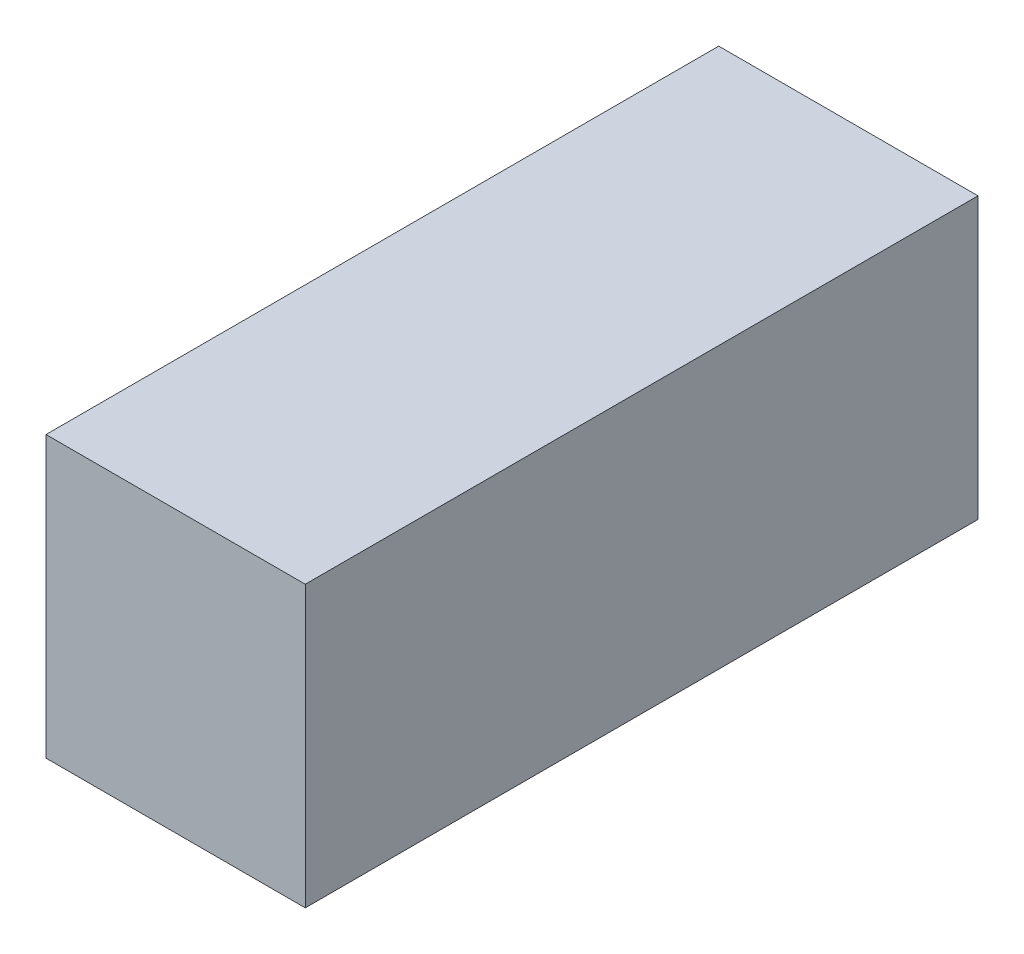
ISO-10303-21;
HEADER;
FILE_DESCRIPTION(('STEP AP214'),'2;1');
FILE_NAME('part.step','',(''),(''),'','','');
FILE_SCHEMA(('AUTOMOTIVE_DESIGN { 1 0 10303 214 1 1 1 1 }'));
ENDSEC;
DATA;
#1=APPLICATION_CONTEXT('core data for automotive mechanical design processes');
#2=APPLICATION_PROTOCOL_DEFINITION('international standard','automotive_design',2000,#1);
#3=PRODUCT_CONTEXT('',#1,'mechanical');
#4=PRODUCT('Part','Part','',(#3));
#5=PRODUCT_RELATED_PRODUCT_CATEGORY('part','',(#4));
#6=PRODUCT_DEFINITION_FORMATION('','',#4);
#7=PRODUCT_DEFINITION_CONTEXT('part definition',#1,'design');
#8=PRODUCT_DEFINITION('design','',#6,#7);
#9=PRODUCT_DEFINITION_SHAPE('','',#8);
#10=(LENGTH_UNIT() NAMED_UNIT(*) SI_UNIT(.MILLI.,.METRE.));
#11=(NAMED_UNIT(*) PLANE_ANGLE_UNIT() SI_UNIT($,.RADIAN.));
#12=(NAMED_UNIT(*) SI_UNIT($,.STERADIAN.) SOLID_ANGLE_UNIT());
#13=UNCERTAINTY_MEASURE_WITH_UNIT(LENGTH_MEASURE(1.E-05),#10,'distance_accuracy_value','');
#14=(GEOMETRIC_REPRESENTATION_CONTEXT(3) GLOBAL_UNCERTAINTY_ASSIGNED_CONTEXT((#13)) GLOBAL_UNIT_ASSIGNED_CONTEXT((#10,
#11,#12)) REPRESENTATION_CONTEXT('',''));
#15=CARTESIAN_POINT('',(0.,0.,0.));
#16=DIRECTION('',(0.,0.,1.));
#17=DIRECTION('',(1.,0.,0.));
#18=AXIS2_PLACEMENT_3D('',#15,#16,#17);
#19=CARTESIAN_POINT('',(0.,0.,480.));
#20=DIRECTION('',(1.,0.,0.));
#21=DIRECTION('',(0.,0.,-1.));
#22=AXIS2_PLACEMENT_3D('',#19,#20,#21);
#23=PLANE('',#22);
#24=DIRECTION('',(0.,-1.,0.));
#25=VECTOR('',#24,1.);
#26=CARTESIAN_POINT('',(0.,0.,0.));
#27=LINE('',#26,#25);
#28=CARTESIAN_POINT('',(0.,200.,0.));
#29=VERTEX_POINT('',#28);
#30=CARTESIAN_POINT('',(0.,0.,0.));
#31=VERTEX_POINT('',#30);
#32=EDGE_CURVE('E111',#29,#31,#27,.T.);
#33=ORIENTED_EDGE('',*,*,#32,.T.);
#34=DIRECTION('',(0.,0.,-1.));
#35=VECTOR('',#34,1.);
#36=CARTESIAN_POINT('',(0.,0.,480.));
#37=LINE('',#36,#35);
#38=CARTESIAN_POINT('',(0.,0.,480.));
#39=VERTEX_POINT('',#38);
#40=EDGE_CURVE('E11',#39,#31,#37,.T.);
#41=ORIENTED_EDGE('',*,*,#40,.F.);
#42=DIRECTION('',(0.,-1.,0.));
#43=VECTOR('',#42,1.);
#44=CARTESIAN_POINT('',(0.,0.,480.));
#45=LINE('',#44,#43);
#46=CARTESIAN_POINT('',(0.,200.,480.));
#47=VERTEX_POINT('',#46);
#48=EDGE_CURVE('E100',#47,#39,#45,.T.);
#49=ORIENTED_EDGE('',*,*,#48,.F.);
#50=DIRECTION('',(0.,0.,-1.));
#51=VECTOR('',#50,1.);
#52=CARTESIAN_POINT('',(0.,200.,480.));
#53=LINE('',#52,#51);
#54=EDGE_CURVE('E108',#47,#29,#53,.T.);
#55=ORIENTED_EDGE('',*,*,#54,.T.);
#56=EDGE_LOOP('',(#33,#41,#49,#55));
#57=FACE_BOUND('',#56,.T.);
#58=ADVANCED_FACE('F44',(#57),#23,.F.);
#59=CARTESIAN_POINT('',(0.,0.,480.));
#60=DIRECTION('',(0.,1.,0.));
#61=DIRECTION('',(0.,0.,1.));
#62=AXIS2_PLACEMENT_3D('',#59,#60,#61);
#63=PLANE('',#62);
#64=DIRECTION('',(1.,0.,0.));
#65=VECTOR('',#64,1.);
#66=CARTESIAN_POINT('',(0.,0.,0.));
#67=LINE('',#66,#65);
#68=CARTESIAN_POINT('',(185.,0.,0.));
#69=VERTEX_POINT('',#68);
#70=EDGE_CURVE('E105',#31,#69,#67,.T.);
#71=ORIENTED_EDGE('',*,*,#70,.T.);
#72=DIRECTION('',(0.,0.,-1.));
#73=VECTOR('',#72,1.);
#74=CARTESIAN_POINT('',(185.,0.,480.));
#75=LINE('',#74,#73);
#76=CARTESIAN_POINT('',(185.,0.,480.));
#77=VERTEX_POINT('',#76);
#78=EDGE_CURVE('E53',#77,#69,#75,.T.);
#79=ORIENTED_EDGE('',*,*,#78,.F.);
#80=DIRECTION('',(1.,0.,0.));
#81=VECTOR('',#80,1.);
#82=CARTESIAN_POINT('',(0.,0.,480.));
#83=LINE('',#82,#81);
#84=EDGE_CURVE('E95',#39,#77,#83,.T.);
#85=ORIENTED_EDGE('',*,*,#84,.F.);
#86=ORIENTED_EDGE('',*,*,#40,.T.);
#87=EDGE_LOOP('',(#71,#79,#85,#86));
#88=FACE_BOUND('',#87,.T.);
#89=ADVANCED_FACE('F102',(#88),#63,.F.);
#90=CARTESIAN_POINT('',(185.,0.,480.));
#91=DIRECTION('',(-1.,0.,0.));
#92=DIRECTION('',(0.,0.,1.));
#93=AXIS2_PLACEMENT_3D('',#90,#91,#92);
#94=PLANE('',#93);
#95=DIRECTION('',(0.,1.,0.));
#96=VECTOR('',#95,1.);
#97=CARTESIAN_POINT('',(185.,0.,0.));
#98=LINE('',#97,#96);
#99=CARTESIAN_POINT('',(185.,200.,0.));
#100=VERTEX_POINT('',#99);
#101=EDGE_CURVE('E80',#69,#100,#98,.T.);
#102=ORIENTED_EDGE('',*,*,#101,.T.);
#103=DIRECTION('',(0.,0.,-1.));
#104=VECTOR('',#103,1.);
#105=CARTESIAN_POINT('',(185.,200.,480.));
#106=LINE('',#105,#104);
#107=CARTESIAN_POINT('',(185.,200.,480.));
#108=VERTEX_POINT('',#107);
#109=EDGE_CURVE('E101',#108,#100,#106,.T.);
#110=ORIENTED_EDGE('',*,*,#109,.F.);
#111=DIRECTION('',(0.,1.,0.));
#112=VECTOR('',#111,1.);
#113=CARTESIAN_POINT('',(185.,0.,480.));
#114=LINE('',#113,#112);
#115=EDGE_CURVE('E94',#77,#108,#114,.T.);
#116=ORIENTED_EDGE('',*,*,#115,.F.);
#117=ORIENTED_EDGE('',*,*,#78,.T.);
#118=EDGE_LOOP('',(#102,#110,#116,#117));
#119=FACE_BOUND('',#118,.T.);
#120=ADVANCED_FACE('F103',(#119),#94,.F.);
#121=CARTESIAN_POINT('',(0.,200.,480.));
#122=DIRECTION('',(0.,-1.,0.));
#123=DIRECTION('',(0.,0.,-1.));
#124=AXIS2_PLACEMENT_3D('',#121,#122,#123);
#125=PLANE('',#124);
#126=DIRECTION('',(-1.,0.,0.));
#127=VECTOR('',#126,1.);
#128=CARTESIAN_POINT('',(0.,200.,0.));
#129=LINE('',#128,#127);
#130=EDGE_CURVE('E82',#100,#29,#129,.T.);
#131=ORIENTED_EDGE('',*,*,#130,.T.);
#132=ORIENTED_EDGE('',*,*,#54,.F.);
#133=DIRECTION('',(-1.,0.,0.));
#134=VECTOR('',#133,1.);
#135=CARTESIAN_POINT('',(0.,200.,480.));
#136=LINE('',#135,#134);
#137=EDGE_CURVE('E62',#108,#47,#136,.T.);
#138=ORIENTED_EDGE('',*,*,#137,.F.);
#139=ORIENTED_EDGE('',*,*,#109,.T.);
#140=EDGE_LOOP('',(#131,#132,#138,#139));
#141=FACE_BOUND('',#140,.T.);
#142=ADVANCED_FACE('F128',(#141),#125,.F.);
#143=CARTESIAN_POINT('',(0.,0.,480.));
#144=DIRECTION('',(0.,0.,-1.));
#145=DIRECTION('',(-1.,0.,0.));
#146=AXIS2_PLACEMENT_3D('',#143,#144,#145);
#147=PLANE('',#146);
#148=ORIENTED_EDGE('',*,*,#48,.T.);
#149=ORIENTED_EDGE('',*,*,#84,.T.);
#150=ORIENTED_EDGE('',*,*,#115,.T.);
#151=ORIENTED_EDGE('',*,*,#137,.T.);
#152=EDGE_LOOP('',(#148,#149,#150,#151));
#153=FACE_BOUND('',#152,.T.);
#154=ADVANCED_FACE('F93',(#153),#147,.F.);
#155=CARTESIAN_POINT('',(0.,0.,0.));
#156=DIRECTION('',(0.,0.,-1.));
#157=DIRECTION('',(-1.,0.,0.));
#158=AXIS2_PLACEMENT_3D('',#155,#156,#157);
#159=PLANE('',#158);
#160=ORIENTED_EDGE('',*,*,#32,.F.);
#161=ORIENTED_EDGE('',*,*,#130,.F.);
#162=ORIENTED_EDGE('',*,*,#101,.F.);
#163=ORIENTED_EDGE('',*,*,#70,.F.);
#164=EDGE_LOOP('',(#160,#161,#162,#163));
#165=FACE_BOUND('',#164,.T.);
#166=ADVANCED_FACE('F129',(#165),#159,.T.);
#167=CLOSED_SHELL('',(#58,#89,#120,#142,#154,#166));
#168=MANIFOLD_SOLID_BREP('B2',#167);
#169=ADVANCED_BREP_SHAPE_REPRESENTATION('',(#18,#168),#14);
#170=SHAPE_DEFINITION_REPRESENTATION(#9,#169);
ENDSEC;
END-ISO-10303-21;
